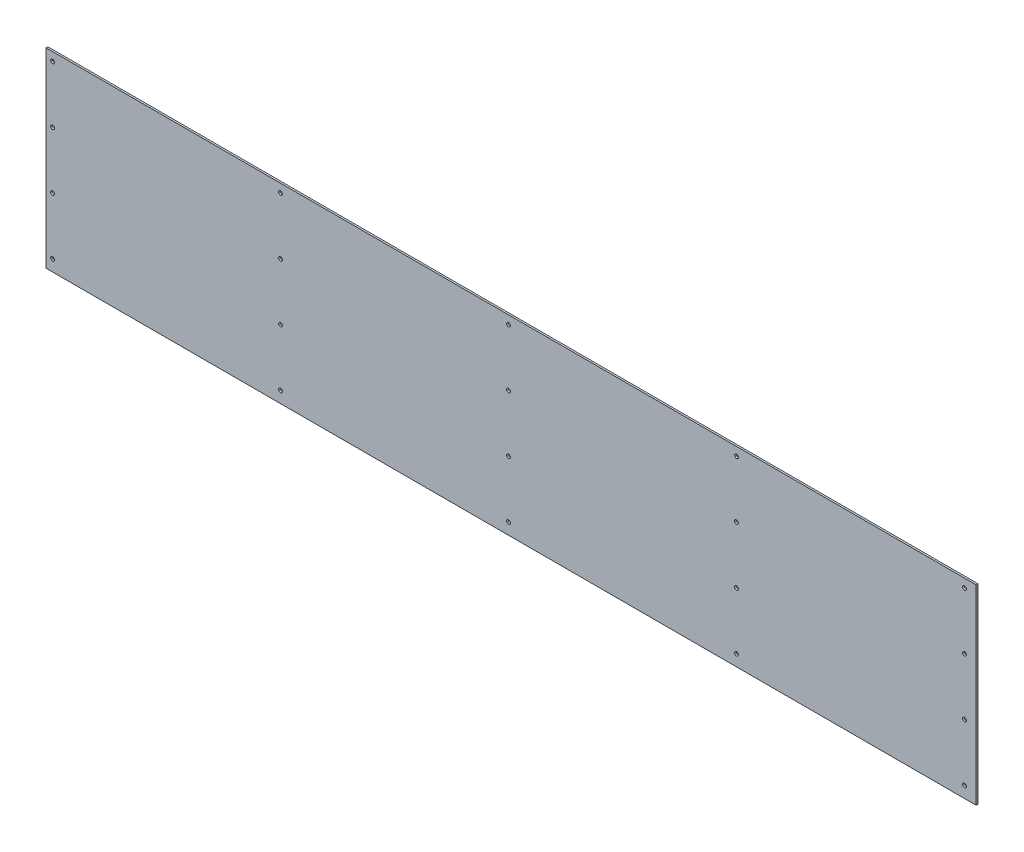
ISO-10303-21;
HEADER;
FILE_DESCRIPTION(('STEP AP214'),'2;1');
FILE_NAME('part.step','',(''),(''),'','','');
FILE_SCHEMA(('AUTOMOTIVE_DESIGN { 1 0 10303 214 1 1 1 1 }'));
ENDSEC;
DATA;
#1=APPLICATION_CONTEXT('core data for automotive mechanical design processes');
#2=APPLICATION_PROTOCOL_DEFINITION('international standard','automotive_design',2000,#1);
#3=PRODUCT_CONTEXT('',#1,'mechanical');
#4=PRODUCT('Part','Part','',(#3));
#5=PRODUCT_RELATED_PRODUCT_CATEGORY('part','',(#4));
#6=PRODUCT_DEFINITION_FORMATION('','',#4);
#7=PRODUCT_DEFINITION_CONTEXT('part definition',#1,'design');
#8=PRODUCT_DEFINITION('design','',#6,#7);
#9=PRODUCT_DEFINITION_SHAPE('','',#8);
#10=(LENGTH_UNIT() NAMED_UNIT(*) SI_UNIT(.MILLI.,.METRE.));
#11=(NAMED_UNIT(*) PLANE_ANGLE_UNIT() SI_UNIT($,.RADIAN.));
#12=(NAMED_UNIT(*) SI_UNIT($,.STERADIAN.) SOLID_ANGLE_UNIT());
#13=UNCERTAINTY_MEASURE_WITH_UNIT(LENGTH_MEASURE(1.E-05),#10,'distance_accuracy_value','');
#14=(GEOMETRIC_REPRESENTATION_CONTEXT(3) GLOBAL_UNCERTAINTY_ASSIGNED_CONTEXT((#13)) GLOBAL_UNIT_ASSIGNED_CONTEXT((#10,
#11,#12)) REPRESENTATION_CONTEXT('',''));
#15=CARTESIAN_POINT('',(0.,0.,0.));
#16=DIRECTION('',(0.,0.,1.));
#17=DIRECTION('',(1.,0.,0.));
#18=AXIS2_PLACEMENT_3D('',#15,#16,#17);
#19=CARTESIAN_POINT('',(-326.805932165718,168.065878378378,-3.175));
#20=DIRECTION('',(-1.,0.,0.));
#21=DIRECTION('',(0.,0.,1.));
#22=AXIS2_PLACEMENT_3D('',#19,#20,#21);
#23=PLANE('',#22);
#24=DIRECTION('',(0.,-1.,0.));
#25=VECTOR('',#24,1.);
#26=CARTESIAN_POINT('',(-326.805932165718,168.065878378378,0.));
#27=LINE('',#26,#25);
#28=CARTESIAN_POINT('',(-326.805932165718,168.065878378378,0.));
#29=VERTEX_POINT('',#28);
#30=CARTESIAN_POINT('',(-326.805932165718,-166.934121621622,0.));
#31=VERTEX_POINT('',#30);
#32=EDGE_CURVE('E103',#29,#31,#27,.T.);
#33=ORIENTED_EDGE('',*,*,#32,.F.);
#34=DIRECTION('',(0.,0.,1.));
#35=VECTOR('',#34,1.);
#36=CARTESIAN_POINT('',(-326.805932165718,168.065878378378,-3.175));
#37=LINE('',#36,#35);
#38=CARTESIAN_POINT('',(-326.805932165718,168.065878378378,-3.175));
#39=VERTEX_POINT('',#38);
#40=EDGE_CURVE('E11',#39,#29,#37,.T.);
#41=ORIENTED_EDGE('',*,*,#40,.F.);
#42=DIRECTION('',(0.,-1.,0.));
#43=VECTOR('',#42,1.);
#44=CARTESIAN_POINT('',(-326.805932165718,168.065878378378,-3.175));
#45=LINE('',#44,#43);
#46=CARTESIAN_POINT('',(-326.805932165718,-166.934121621622,-3.175));
#47=VERTEX_POINT('',#46);
#48=EDGE_CURVE('E96',#39,#47,#45,.T.);
#49=ORIENTED_EDGE('',*,*,#48,.T.);
#50=DIRECTION('',(0.,0.,1.));
#51=VECTOR('',#50,1.);
#52=CARTESIAN_POINT('',(-326.805932165718,-166.934121621622,-3.175));
#53=LINE('',#52,#51);
#54=EDGE_CURVE('E41',#47,#31,#53,.T.);
#55=ORIENTED_EDGE('',*,*,#54,.T.);
#56=EDGE_LOOP('',(#33,#41,#49,#55));
#57=FACE_BOUND('',#56,.T.);
#58=ADVANCED_FACE('F38',(#57),#23,.T.);
#59=CARTESIAN_POINT('',(-326.805932165718,168.065878378378,-3.175));
#60=DIRECTION('',(0.,1.,0.));
#61=DIRECTION('',(0.,0.,1.));
#62=AXIS2_PLACEMENT_3D('',#59,#60,#61);
#63=PLANE('',#62);
#64=DIRECTION('',(-1.,0.,0.));
#65=VECTOR('',#64,1.);
#66=CARTESIAN_POINT('',(-326.805932165718,168.065878378378,0.));
#67=LINE('',#66,#65);
#68=CARTESIAN_POINT('',(1305.19406783428,168.065878378378,0.));
#69=VERTEX_POINT('',#68);
#70=EDGE_CURVE('E98',#69,#29,#67,.T.);
#71=ORIENTED_EDGE('',*,*,#70,.F.);
#72=DIRECTION('',(0.,0.,1.));
#73=VECTOR('',#72,1.);
#74=CARTESIAN_POINT('',(1305.19406783428,168.065878378378,-3.175));
#75=LINE('',#74,#73);
#76=CARTESIAN_POINT('',(1305.19406783428,168.065878378378,-3.175));
#77=VERTEX_POINT('',#76);
#78=EDGE_CURVE('E47',#77,#69,#75,.T.);
#79=ORIENTED_EDGE('',*,*,#78,.F.);
#80=DIRECTION('',(-1.,0.,0.));
#81=VECTOR('',#80,1.);
#82=CARTESIAN_POINT('',(-326.805932165718,168.065878378378,-3.175));
#83=LINE('',#82,#81);
#84=EDGE_CURVE('E93',#77,#39,#83,.T.);
#85=ORIENTED_EDGE('',*,*,#84,.T.);
#86=ORIENTED_EDGE('',*,*,#40,.T.);
#87=EDGE_LOOP('',(#71,#79,#85,#86));
#88=FACE_BOUND('',#87,.T.);
#89=ADVANCED_FACE('F114',(#88),#63,.T.);
#90=CARTESIAN_POINT('',(1305.19406783428,168.065878378378,-3.175));
#91=DIRECTION('',(1.,0.,0.));
#92=DIRECTION('',(0.,0.,-1.));
#93=AXIS2_PLACEMENT_3D('',#90,#91,#92);
#94=PLANE('',#93);
#95=DIRECTION('',(0.,1.,0.));
#96=VECTOR('',#95,1.);
#97=CARTESIAN_POINT('',(1305.19406783428,168.065878378378,0.));
#98=LINE('',#97,#96);
#99=CARTESIAN_POINT('',(1305.19406783428,-166.934121621622,0.));
#100=VERTEX_POINT('',#99);
#101=EDGE_CURVE('E88',#100,#69,#98,.T.);
#102=ORIENTED_EDGE('',*,*,#101,.F.);
#103=DIRECTION('',(0.,0.,1.));
#104=VECTOR('',#103,1.);
#105=CARTESIAN_POINT('',(1305.19406783428,-166.934121621622,-3.175));
#106=LINE('',#105,#104);
#107=CARTESIAN_POINT('',(1305.19406783428,-166.934121621622,-3.175));
#108=VERTEX_POINT('',#107);
#109=EDGE_CURVE('E83',#108,#100,#106,.T.);
#110=ORIENTED_EDGE('',*,*,#109,.F.);
#111=DIRECTION('',(0.,1.,0.));
#112=VECTOR('',#111,1.);
#113=CARTESIAN_POINT('',(1305.19406783428,168.065878378378,-3.175));
#114=LINE('',#113,#112);
#115=EDGE_CURVE('E86',#108,#77,#114,.T.);
#116=ORIENTED_EDGE('',*,*,#115,.T.);
#117=ORIENTED_EDGE('',*,*,#78,.T.);
#118=EDGE_LOOP('',(#102,#110,#116,#117));
#119=FACE_BOUND('',#118,.T.);
#120=ADVANCED_FACE('F85',(#119),#94,.T.);
#121=CARTESIAN_POINT('',(-326.805932165718,-166.934121621622,-3.175));
#122=DIRECTION('',(0.,-1.,0.));
#123=DIRECTION('',(0.,0.,-1.));
#124=AXIS2_PLACEMENT_3D('',#121,#122,#123);
#125=PLANE('',#124);
#126=DIRECTION('',(1.,0.,0.));
#127=VECTOR('',#126,1.);
#128=CARTESIAN_POINT('',(-326.805932165718,-166.934121621622,0.));
#129=LINE('',#128,#127);
#130=EDGE_CURVE('E106',#31,#100,#129,.T.);
#131=ORIENTED_EDGE('',*,*,#130,.F.);
#132=ORIENTED_EDGE('',*,*,#54,.F.);
#133=DIRECTION('',(1.,0.,0.));
#134=VECTOR('',#133,1.);
#135=CARTESIAN_POINT('',(-326.805932165718,-166.934121621622,-3.175));
#136=LINE('',#135,#134);
#137=EDGE_CURVE('E92',#47,#108,#136,.T.);
#138=ORIENTED_EDGE('',*,*,#137,.T.);
#139=ORIENTED_EDGE('',*,*,#109,.T.);
#140=EDGE_LOOP('',(#131,#132,#138,#139));
#141=FACE_BOUND('',#140,.T.);
#142=ADVANCED_FACE('F95',(#141),#125,.T.);
#143=CARTESIAN_POINT('',(0.,0.,-3.175));
#144=DIRECTION('',(0.,0.,1.));
#145=DIRECTION('',(1.,0.,0.));
#146=AXIS2_PLACEMENT_3D('',#143,#144,#145);
#147=PLANE('',#146);
#148=CARTESIAN_POINT('',(1284.69406783428,153.065878378378,-3.175));
#149=DIRECTION('',(0.,0.,1.));
#150=DIRECTION('',(1.,0.,0.));
#151=AXIS2_PLACEMENT_3D('',#148,#149,#150);
#152=CIRCLE('',#151,3.3782);
#153=CARTESIAN_POINT('',(1288.07226783428,153.065878378378,-3.175));
#154=VERTEX_POINT('',#153);
#155=EDGE_CURVE('E219',#154,#154,#152,.T.);
#156=ORIENTED_EDGE('',*,*,#155,.T.);
#157=EDGE_LOOP('',(#156));
#158=FACE_BOUND('',#157,.T.);
#159=CARTESIAN_POINT('',(884.694067834282,153.065878378376,-3.175));
#160=DIRECTION('',(0.,0.,1.));
#161=DIRECTION('',(1.,0.,0.));
#162=AXIS2_PLACEMENT_3D('',#159,#160,#161);
#163=CIRCLE('',#162,3.3782);
#164=CARTESIAN_POINT('',(888.072267834282,153.065878378376,-3.175));
#165=VERTEX_POINT('',#164);
#166=EDGE_CURVE('E229',#165,#165,#163,.T.);
#167=ORIENTED_EDGE('',*,*,#166,.T.);
#168=EDGE_LOOP('',(#167));
#169=FACE_BOUND('',#168,.T.);
#170=CARTESIAN_POINT('',(484.694067834282,153.065878378373,-3.175));
#171=DIRECTION('',(0.,0.,1.));
#172=DIRECTION('',(1.,0.,0.));
#173=AXIS2_PLACEMENT_3D('',#170,#171,#172);
#174=CIRCLE('',#173,3.3782);
#175=CARTESIAN_POINT('',(488.072267834282,153.065878378373,-3.175));
#176=VERTEX_POINT('',#175);
#177=EDGE_CURVE('E235',#176,#176,#174,.T.);
#178=ORIENTED_EDGE('',*,*,#177,.T.);
#179=EDGE_LOOP('',(#178));
#180=FACE_BOUND('',#179,.T.);
#181=CARTESIAN_POINT('',(84.6940678342816,153.06587837837,-3.175));
#182=DIRECTION('',(0.,0.,1.));
#183=DIRECTION('',(1.,0.,0.));
#184=AXIS2_PLACEMENT_3D('',#181,#182,#183);
#185=CIRCLE('',#184,3.3782);
#186=CARTESIAN_POINT('',(88.0722678342816,153.06587837837,-3.175));
#187=VERTEX_POINT('',#186);
#188=EDGE_CURVE('E241',#187,#187,#185,.T.);
#189=ORIENTED_EDGE('',*,*,#188,.T.);
#190=EDGE_LOOP('',(#189));
#191=FACE_BOUND('',#190,.T.);
#192=CARTESIAN_POINT('',(-315.305932165718,153.065878378367,-3.175));
#193=DIRECTION('',(0.,0.,1.));
#194=DIRECTION('',(1.,0.,0.));
#195=AXIS2_PLACEMENT_3D('',#192,#193,#194);
#196=CIRCLE('',#195,3.3782);
#197=CARTESIAN_POINT('',(-311.927732165718,153.065878378367,-3.175));
#198=VERTEX_POINT('',#197);
#199=EDGE_CURVE('E247',#198,#198,#196,.T.);
#200=ORIENTED_EDGE('',*,*,#199,.T.);
#201=EDGE_LOOP('',(#200));
#202=FACE_BOUND('',#201,.T.);
#203=CARTESIAN_POINT('',(884.694067834283,53.0658783783756,-3.175));
#204=DIRECTION('',(0.,0.,1.));
#205=DIRECTION('',(1.,0.,0.));
#206=AXIS2_PLACEMENT_3D('',#203,#204,#205);
#207=CIRCLE('',#206,3.3782);
#208=CARTESIAN_POINT('',(888.072267834283,53.0658783783756,-3.175));
#209=VERTEX_POINT('',#208);
#210=EDGE_CURVE('E253',#209,#209,#207,.T.);
#211=ORIENTED_EDGE('',*,*,#210,.T.);
#212=EDGE_LOOP('',(#211));
#213=FACE_BOUND('',#212,.T.);
#214=CARTESIAN_POINT('',(484.694067834283,53.0658783783728,-3.175));
#215=DIRECTION('',(0.,0.,1.));
#216=DIRECTION('',(1.,0.,0.));
#217=AXIS2_PLACEMENT_3D('',#214,#215,#216);
#218=CIRCLE('',#217,3.3782);
#219=CARTESIAN_POINT('',(488.072267834283,53.0658783783728,-3.175));
#220=VERTEX_POINT('',#219);
#221=EDGE_CURVE('E259',#220,#220,#218,.T.);
#222=ORIENTED_EDGE('',*,*,#221,.T.);
#223=EDGE_LOOP('',(#222));
#224=FACE_BOUND('',#223,.T.);
#225=CARTESIAN_POINT('',(84.6940678342827,53.06587837837,-3.175));
#226=DIRECTION('',(0.,0.,1.));
#227=DIRECTION('',(1.,0.,0.));
#228=AXIS2_PLACEMENT_3D('',#225,#226,#227);
#229=CIRCLE('',#228,3.3782);
#230=CARTESIAN_POINT('',(88.0722678342827,53.06587837837,-3.175));
#231=VERTEX_POINT('',#230);
#232=EDGE_CURVE('E265',#231,#231,#229,.T.);
#233=ORIENTED_EDGE('',*,*,#232,.T.);
#234=EDGE_LOOP('',(#233));
#235=FACE_BOUND('',#234,.T.);
#236=CARTESIAN_POINT('',(-315.305932165717,53.0658783783673,-3.175));
#237=DIRECTION('',(0.,0.,1.));
#238=DIRECTION('',(1.,0.,0.));
#239=AXIS2_PLACEMENT_3D('',#236,#237,#238);
#240=CIRCLE('',#239,3.3782);
#241=CARTESIAN_POINT('',(-311.927732165717,53.0658783783673,-3.175));
#242=VERTEX_POINT('',#241);
#243=EDGE_CURVE('E271',#242,#242,#240,.T.);
#244=ORIENTED_EDGE('',*,*,#243,.T.);
#245=EDGE_LOOP('',(#244));
#246=FACE_BOUND('',#245,.T.);
#247=CARTESIAN_POINT('',(884.694067834284,-46.9341216216244,-3.175));
#248=DIRECTION('',(0.,0.,1.));
#249=DIRECTION('',(1.,0.,0.));
#250=AXIS2_PLACEMENT_3D('',#247,#248,#249);
#251=CIRCLE('',#250,3.3782);
#252=CARTESIAN_POINT('',(888.072267834284,-46.9341216216244,-3.175));
#253=VERTEX_POINT('',#252);
#254=EDGE_CURVE('E277',#253,#253,#251,.T.);
#255=ORIENTED_EDGE('',*,*,#254,.T.);
#256=EDGE_LOOP('',(#255));
#257=FACE_BOUND('',#256,.T.);
#258=CARTESIAN_POINT('',(484.694067834284,-46.9341216216272,-3.175));
#259=DIRECTION('',(0.,0.,1.));
#260=DIRECTION('',(1.,0.,0.));
#261=AXIS2_PLACEMENT_3D('',#258,#259,#260);
#262=CIRCLE('',#261,3.3782);
#263=CARTESIAN_POINT('',(488.072267834284,-46.9341216216272,-3.175));
#264=VERTEX_POINT('',#263);
#265=EDGE_CURVE('E283',#264,#264,#262,.T.);
#266=ORIENTED_EDGE('',*,*,#265,.T.);
#267=EDGE_LOOP('',(#266));
#268=FACE_BOUND('',#267,.T.);
#269=CARTESIAN_POINT('',(84.6940678342836,-46.93412162163,-3.175));
#270=DIRECTION('',(0.,0.,1.));
#271=DIRECTION('',(1.,0.,0.));
#272=AXIS2_PLACEMENT_3D('',#269,#270,#271);
#273=CIRCLE('',#272,3.3782);
#274=CARTESIAN_POINT('',(88.0722678342836,-46.93412162163,-3.175));
#275=VERTEX_POINT('',#274);
#276=EDGE_CURVE('E289',#275,#275,#273,.T.);
#277=ORIENTED_EDGE('',*,*,#276,.T.);
#278=EDGE_LOOP('',(#277));
#279=FACE_BOUND('',#278,.T.);
#280=CARTESIAN_POINT('',(-315.305932165716,-46.9341216216328,-3.175));
#281=DIRECTION('',(0.,0.,1.));
#282=DIRECTION('',(1.,0.,0.));
#283=AXIS2_PLACEMENT_3D('',#280,#281,#282);
#284=CIRCLE('',#283,3.3782);
#285=CARTESIAN_POINT('',(-311.927732165716,-46.9341216216328,-3.175));
#286=VERTEX_POINT('',#285);
#287=EDGE_CURVE('E295',#286,#286,#284,.T.);
#288=ORIENTED_EDGE('',*,*,#287,.T.);
#289=EDGE_LOOP('',(#288));
#290=FACE_BOUND('',#289,.T.);
#291=CARTESIAN_POINT('',(884.694067834285,-146.934121621624,-3.175));
#292=DIRECTION('',(0.,0.,1.));
#293=DIRECTION('',(1.,0.,0.));
#294=AXIS2_PLACEMENT_3D('',#291,#292,#293);
#295=CIRCLE('',#294,3.3782);
#296=CARTESIAN_POINT('',(888.072267834285,-146.934121621624,-3.175));
#297=VERTEX_POINT('',#296);
#298=EDGE_CURVE('E301',#297,#297,#295,.T.);
#299=ORIENTED_EDGE('',*,*,#298,.T.);
#300=EDGE_LOOP('',(#299));
#301=FACE_BOUND('',#300,.T.);
#302=CARTESIAN_POINT('',(484.694067834285,-146.934121621627,-3.175));
#303=DIRECTION('',(0.,0.,1.));
#304=DIRECTION('',(1.,0.,0.));
#305=AXIS2_PLACEMENT_3D('',#302,#303,#304);
#306=CIRCLE('',#305,3.3782);
#307=CARTESIAN_POINT('',(488.072267834285,-146.934121621627,-3.175));
#308=VERTEX_POINT('',#307);
#309=EDGE_CURVE('E307',#308,#308,#306,.T.);
#310=ORIENTED_EDGE('',*,*,#309,.T.);
#311=EDGE_LOOP('',(#310));
#312=FACE_BOUND('',#311,.T.);
#313=CARTESIAN_POINT('',(84.6940678342847,-146.93412162163,-3.175));
#314=DIRECTION('',(0.,0.,1.));
#315=DIRECTION('',(1.,0.,0.));
#316=AXIS2_PLACEMENT_3D('',#313,#314,#315);
#317=CIRCLE('',#316,3.3782);
#318=CARTESIAN_POINT('',(88.0722678342847,-146.93412162163,-3.175));
#319=VERTEX_POINT('',#318);
#320=EDGE_CURVE('E313',#319,#319,#317,.T.);
#321=ORIENTED_EDGE('',*,*,#320,.T.);
#322=EDGE_LOOP('',(#321));
#323=FACE_BOUND('',#322,.T.);
#324=CARTESIAN_POINT('',(-315.305932165715,-146.934121621633,-3.175));
#325=DIRECTION('',(0.,0.,1.));
#326=DIRECTION('',(1.,0.,0.));
#327=AXIS2_PLACEMENT_3D('',#324,#325,#326);
#328=CIRCLE('',#327,3.3782);
#329=CARTESIAN_POINT('',(-311.927732165715,-146.934121621633,-3.175));
#330=VERTEX_POINT('',#329);
#331=EDGE_CURVE('E319',#330,#330,#328,.T.);
#332=ORIENTED_EDGE('',*,*,#331,.T.);
#333=EDGE_LOOP('',(#332));
#334=FACE_BOUND('',#333,.T.);
#335=CARTESIAN_POINT('',(1284.69406783428,53.0658783783784,-3.175));
#336=DIRECTION('',(0.,0.,1.));
#337=DIRECTION('',(1.,0.,0.));
#338=AXIS2_PLACEMENT_3D('',#335,#336,#337);
#339=CIRCLE('',#338,3.3782);
#340=CARTESIAN_POINT('',(1288.07226783428,53.0658783783784,-3.175));
#341=VERTEX_POINT('',#340);
#342=EDGE_CURVE('E325',#341,#341,#339,.T.);
#343=ORIENTED_EDGE('',*,*,#342,.T.);
#344=EDGE_LOOP('',(#343));
#345=FACE_BOUND('',#344,.T.);
#346=CARTESIAN_POINT('',(1284.69406783428,-46.9341216216216,-3.175));
#347=DIRECTION('',(0.,0.,1.));
#348=DIRECTION('',(1.,0.,0.));
#349=AXIS2_PLACEMENT_3D('',#346,#347,#348);
#350=CIRCLE('',#349,3.3782);
#351=CARTESIAN_POINT('',(1288.07226783428,-46.9341216216216,-3.175));
#352=VERTEX_POINT('',#351);
#353=EDGE_CURVE('E331',#352,#352,#350,.T.);
#354=ORIENTED_EDGE('',*,*,#353,.T.);
#355=EDGE_LOOP('',(#354));
#356=FACE_BOUND('',#355,.T.);
#357=CARTESIAN_POINT('',(1284.69406783428,-146.934121621622,-3.175));
#358=DIRECTION('',(0.,0.,1.));
#359=DIRECTION('',(1.,0.,0.));
#360=AXIS2_PLACEMENT_3D('',#357,#358,#359);
#361=CIRCLE('',#360,3.3782);
#362=CARTESIAN_POINT('',(1288.07226783428,-146.934121621622,-3.175));
#363=VERTEX_POINT('',#362);
#364=EDGE_CURVE('E107',#363,#363,#361,.T.);
#365=ORIENTED_EDGE('',*,*,#364,.T.);
#366=EDGE_LOOP('',(#365));
#367=FACE_BOUND('',#366,.T.);
#368=ORIENTED_EDGE('',*,*,#48,.F.);
#369=ORIENTED_EDGE('',*,*,#84,.F.);
#370=ORIENTED_EDGE('',*,*,#115,.F.);
#371=ORIENTED_EDGE('',*,*,#137,.F.);
#372=EDGE_LOOP('',(#368,#369,#370,#371));
#373=FACE_BOUND('',#372,.T.);
#374=ADVANCED_FACE('F91',(#158,#169,#180,#191,#202,#213,#224,#235,#246,#257,#268,#279,#290,#301,
#312,#323,#334,#345,#356,#367,#373),#147,.F.);
#375=CARTESIAN_POINT('',(0.,0.,0.));
#376=DIRECTION('',(0.,0.,1.));
#377=DIRECTION('',(1.,0.,0.));
#378=AXIS2_PLACEMENT_3D('',#375,#376,#377);
#379=PLANE('',#378);
#380=CARTESIAN_POINT('',(1284.69406783428,153.065878378378,0.));
#381=DIRECTION('',(0.,0.,1.));
#382=DIRECTION('',(1.,0.,0.));
#383=AXIS2_PLACEMENT_3D('',#380,#381,#382);
#384=CIRCLE('',#383,3.3782);
#385=CARTESIAN_POINT('',(1288.07226783428,153.065878378378,0.));
#386=VERTEX_POINT('',#385);
#387=EDGE_CURVE('E222',#386,#386,#384,.T.);
#388=ORIENTED_EDGE('',*,*,#387,.F.);
#389=EDGE_LOOP('',(#388));
#390=FACE_BOUND('',#389,.T.);
#391=CARTESIAN_POINT('',(884.694067834282,153.065878378376,0.));
#392=DIRECTION('',(0.,0.,1.));
#393=DIRECTION('',(1.,0.,0.));
#394=AXIS2_PLACEMENT_3D('',#391,#392,#393);
#395=CIRCLE('',#394,3.3782);
#396=CARTESIAN_POINT('',(888.072267834282,153.065878378376,0.));
#397=VERTEX_POINT('',#396);
#398=EDGE_CURVE('E224',#397,#397,#395,.T.);
#399=ORIENTED_EDGE('',*,*,#398,.F.);
#400=EDGE_LOOP('',(#399));
#401=FACE_BOUND('',#400,.T.);
#402=CARTESIAN_POINT('',(484.694067834282,153.065878378373,0.));
#403=DIRECTION('',(0.,0.,1.));
#404=DIRECTION('',(1.,0.,0.));
#405=AXIS2_PLACEMENT_3D('',#402,#403,#404);
#406=CIRCLE('',#405,3.3782);
#407=CARTESIAN_POINT('',(488.072267834282,153.065878378373,0.));
#408=VERTEX_POINT('',#407);
#409=EDGE_CURVE('E232',#408,#408,#406,.T.);
#410=ORIENTED_EDGE('',*,*,#409,.F.);
#411=EDGE_LOOP('',(#410));
#412=FACE_BOUND('',#411,.T.);
#413=CARTESIAN_POINT('',(84.6940678342816,153.06587837837,0.));
#414=DIRECTION('',(0.,0.,1.));
#415=DIRECTION('',(1.,0.,0.));
#416=AXIS2_PLACEMENT_3D('',#413,#414,#415);
#417=CIRCLE('',#416,3.3782);
#418=CARTESIAN_POINT('',(88.0722678342816,153.06587837837,0.));
#419=VERTEX_POINT('',#418);
#420=EDGE_CURVE('E238',#419,#419,#417,.T.);
#421=ORIENTED_EDGE('',*,*,#420,.F.);
#422=EDGE_LOOP('',(#421));
#423=FACE_BOUND('',#422,.T.);
#424=CARTESIAN_POINT('',(-315.305932165718,153.065878378367,0.));
#425=DIRECTION('',(0.,0.,1.));
#426=DIRECTION('',(1.,0.,0.));
#427=AXIS2_PLACEMENT_3D('',#424,#425,#426);
#428=CIRCLE('',#427,3.3782);
#429=CARTESIAN_POINT('',(-311.927732165718,153.065878378367,0.));
#430=VERTEX_POINT('',#429);
#431=EDGE_CURVE('E244',#430,#430,#428,.T.);
#432=ORIENTED_EDGE('',*,*,#431,.F.);
#433=EDGE_LOOP('',(#432));
#434=FACE_BOUND('',#433,.T.);
#435=CARTESIAN_POINT('',(884.694067834283,53.0658783783756,0.));
#436=DIRECTION('',(0.,0.,1.));
#437=DIRECTION('',(1.,0.,0.));
#438=AXIS2_PLACEMENT_3D('',#435,#436,#437);
#439=CIRCLE('',#438,3.3782);
#440=CARTESIAN_POINT('',(888.072267834283,53.0658783783756,0.));
#441=VERTEX_POINT('',#440);
#442=EDGE_CURVE('E250',#441,#441,#439,.T.);
#443=ORIENTED_EDGE('',*,*,#442,.F.);
#444=EDGE_LOOP('',(#443));
#445=FACE_BOUND('',#444,.T.);
#446=CARTESIAN_POINT('',(484.694067834283,53.0658783783728,0.));
#447=DIRECTION('',(0.,0.,1.));
#448=DIRECTION('',(1.,0.,0.));
#449=AXIS2_PLACEMENT_3D('',#446,#447,#448);
#450=CIRCLE('',#449,3.3782);
#451=CARTESIAN_POINT('',(488.072267834283,53.0658783783728,0.));
#452=VERTEX_POINT('',#451);
#453=EDGE_CURVE('E256',#452,#452,#450,.T.);
#454=ORIENTED_EDGE('',*,*,#453,.F.);
#455=EDGE_LOOP('',(#454));
#456=FACE_BOUND('',#455,.T.);
#457=CARTESIAN_POINT('',(84.6940678342827,53.06587837837,0.));
#458=DIRECTION('',(0.,0.,1.));
#459=DIRECTION('',(1.,0.,0.));
#460=AXIS2_PLACEMENT_3D('',#457,#458,#459);
#461=CIRCLE('',#460,3.3782);
#462=CARTESIAN_POINT('',(88.0722678342827,53.06587837837,0.));
#463=VERTEX_POINT('',#462);
#464=EDGE_CURVE('E262',#463,#463,#461,.T.);
#465=ORIENTED_EDGE('',*,*,#464,.F.);
#466=EDGE_LOOP('',(#465));
#467=FACE_BOUND('',#466,.T.);
#468=CARTESIAN_POINT('',(-315.305932165717,53.0658783783673,0.));
#469=DIRECTION('',(0.,0.,1.));
#470=DIRECTION('',(1.,0.,0.));
#471=AXIS2_PLACEMENT_3D('',#468,#469,#470);
#472=CIRCLE('',#471,3.3782);
#473=CARTESIAN_POINT('',(-311.927732165717,53.0658783783673,0.));
#474=VERTEX_POINT('',#473);
#475=EDGE_CURVE('E268',#474,#474,#472,.T.);
#476=ORIENTED_EDGE('',*,*,#475,.F.);
#477=EDGE_LOOP('',(#476));
#478=FACE_BOUND('',#477,.T.);
#479=CARTESIAN_POINT('',(884.694067834284,-46.9341216216244,0.));
#480=DIRECTION('',(0.,0.,1.));
#481=DIRECTION('',(1.,0.,0.));
#482=AXIS2_PLACEMENT_3D('',#479,#480,#481);
#483=CIRCLE('',#482,3.3782);
#484=CARTESIAN_POINT('',(888.072267834284,-46.9341216216244,0.));
#485=VERTEX_POINT('',#484);
#486=EDGE_CURVE('E274',#485,#485,#483,.T.);
#487=ORIENTED_EDGE('',*,*,#486,.F.);
#488=EDGE_LOOP('',(#487));
#489=FACE_BOUND('',#488,.T.);
#490=CARTESIAN_POINT('',(484.694067834284,-46.9341216216272,0.));
#491=DIRECTION('',(0.,0.,1.));
#492=DIRECTION('',(1.,0.,0.));
#493=AXIS2_PLACEMENT_3D('',#490,#491,#492);
#494=CIRCLE('',#493,3.3782);
#495=CARTESIAN_POINT('',(488.072267834284,-46.9341216216272,0.));
#496=VERTEX_POINT('',#495);
#497=EDGE_CURVE('E280',#496,#496,#494,.T.);
#498=ORIENTED_EDGE('',*,*,#497,.F.);
#499=EDGE_LOOP('',(#498));
#500=FACE_BOUND('',#499,.T.);
#501=CARTESIAN_POINT('',(84.6940678342836,-46.93412162163,0.));
#502=DIRECTION('',(0.,0.,1.));
#503=DIRECTION('',(1.,0.,0.));
#504=AXIS2_PLACEMENT_3D('',#501,#502,#503);
#505=CIRCLE('',#504,3.3782);
#506=CARTESIAN_POINT('',(88.0722678342836,-46.93412162163,0.));
#507=VERTEX_POINT('',#506);
#508=EDGE_CURVE('E286',#507,#507,#505,.T.);
#509=ORIENTED_EDGE('',*,*,#508,.F.);
#510=EDGE_LOOP('',(#509));
#511=FACE_BOUND('',#510,.T.);
#512=CARTESIAN_POINT('',(-315.305932165716,-46.9341216216328,0.));
#513=DIRECTION('',(0.,0.,1.));
#514=DIRECTION('',(1.,0.,0.));
#515=AXIS2_PLACEMENT_3D('',#512,#513,#514);
#516=CIRCLE('',#515,3.3782);
#517=CARTESIAN_POINT('',(-311.927732165716,-46.9341216216328,0.));
#518=VERTEX_POINT('',#517);
#519=EDGE_CURVE('E292',#518,#518,#516,.T.);
#520=ORIENTED_EDGE('',*,*,#519,.F.);
#521=EDGE_LOOP('',(#520));
#522=FACE_BOUND('',#521,.T.);
#523=CARTESIAN_POINT('',(884.694067834285,-146.934121621624,0.));
#524=DIRECTION('',(0.,0.,1.));
#525=DIRECTION('',(1.,0.,0.));
#526=AXIS2_PLACEMENT_3D('',#523,#524,#525);
#527=CIRCLE('',#526,3.3782);
#528=CARTESIAN_POINT('',(888.072267834285,-146.934121621624,0.));
#529=VERTEX_POINT('',#528);
#530=EDGE_CURVE('E298',#529,#529,#527,.T.);
#531=ORIENTED_EDGE('',*,*,#530,.F.);
#532=EDGE_LOOP('',(#531));
#533=FACE_BOUND('',#532,.T.);
#534=CARTESIAN_POINT('',(484.694067834285,-146.934121621627,0.));
#535=DIRECTION('',(0.,0.,1.));
#536=DIRECTION('',(1.,0.,0.));
#537=AXIS2_PLACEMENT_3D('',#534,#535,#536);
#538=CIRCLE('',#537,3.3782);
#539=CARTESIAN_POINT('',(488.072267834285,-146.934121621627,0.));
#540=VERTEX_POINT('',#539);
#541=EDGE_CURVE('E304',#540,#540,#538,.T.);
#542=ORIENTED_EDGE('',*,*,#541,.F.);
#543=EDGE_LOOP('',(#542));
#544=FACE_BOUND('',#543,.T.);
#545=CARTESIAN_POINT('',(84.6940678342847,-146.93412162163,0.));
#546=DIRECTION('',(0.,0.,1.));
#547=DIRECTION('',(1.,0.,0.));
#548=AXIS2_PLACEMENT_3D('',#545,#546,#547);
#549=CIRCLE('',#548,3.3782);
#550=CARTESIAN_POINT('',(88.0722678342847,-146.93412162163,0.));
#551=VERTEX_POINT('',#550);
#552=EDGE_CURVE('E310',#551,#551,#549,.T.);
#553=ORIENTED_EDGE('',*,*,#552,.F.);
#554=EDGE_LOOP('',(#553));
#555=FACE_BOUND('',#554,.T.);
#556=CARTESIAN_POINT('',(-315.305932165715,-146.934121621633,0.));
#557=DIRECTION('',(0.,0.,1.));
#558=DIRECTION('',(1.,0.,0.));
#559=AXIS2_PLACEMENT_3D('',#556,#557,#558);
#560=CIRCLE('',#559,3.3782);
#561=CARTESIAN_POINT('',(-311.927732165715,-146.934121621633,0.));
#562=VERTEX_POINT('',#561);
#563=EDGE_CURVE('E316',#562,#562,#560,.T.);
#564=ORIENTED_EDGE('',*,*,#563,.F.);
#565=EDGE_LOOP('',(#564));
#566=FACE_BOUND('',#565,.T.);
#567=CARTESIAN_POINT('',(1284.69406783428,53.0658783783784,0.));
#568=DIRECTION('',(0.,0.,1.));
#569=DIRECTION('',(1.,0.,0.));
#570=AXIS2_PLACEMENT_3D('',#567,#568,#569);
#571=CIRCLE('',#570,3.3782);
#572=CARTESIAN_POINT('',(1288.07226783428,53.0658783783784,0.));
#573=VERTEX_POINT('',#572);
#574=EDGE_CURVE('E322',#573,#573,#571,.T.);
#575=ORIENTED_EDGE('',*,*,#574,.F.);
#576=EDGE_LOOP('',(#575));
#577=FACE_BOUND('',#576,.T.);
#578=CARTESIAN_POINT('',(1284.69406783428,-46.9341216216216,0.));
#579=DIRECTION('',(0.,0.,1.));
#580=DIRECTION('',(1.,0.,0.));
#581=AXIS2_PLACEMENT_3D('',#578,#579,#580);
#582=CIRCLE('',#581,3.3782);
#583=CARTESIAN_POINT('',(1288.07226783428,-46.9341216216216,0.));
#584=VERTEX_POINT('',#583);
#585=EDGE_CURVE('E328',#584,#584,#582,.T.);
#586=ORIENTED_EDGE('',*,*,#585,.F.);
#587=EDGE_LOOP('',(#586));
#588=FACE_BOUND('',#587,.T.);
#589=CARTESIAN_POINT('',(1284.69406783428,-146.934121621622,0.));
#590=DIRECTION('',(0.,0.,1.));
#591=DIRECTION('',(1.,0.,0.));
#592=AXIS2_PLACEMENT_3D('',#589,#590,#591);
#593=CIRCLE('',#592,3.3782);
#594=CARTESIAN_POINT('',(1288.07226783428,-146.934121621622,0.));
#595=VERTEX_POINT('',#594);
#596=EDGE_CURVE('E334',#595,#595,#593,.T.);
#597=ORIENTED_EDGE('',*,*,#596,.F.);
#598=EDGE_LOOP('',(#597));
#599=FACE_BOUND('',#598,.T.);
#600=ORIENTED_EDGE('',*,*,#32,.T.);
#601=ORIENTED_EDGE('',*,*,#130,.T.);
#602=ORIENTED_EDGE('',*,*,#101,.T.);
#603=ORIENTED_EDGE('',*,*,#70,.T.);
#604=EDGE_LOOP('',(#600,#601,#602,#603));
#605=FACE_BOUND('',#604,.T.);
#606=ADVANCED_FACE('F113',(#390,#401,#412,#423,#434,#445,#456,#467,#478,#489,#500,#511,#522,
#533,#544,#555,#566,#577,#588,#599,#605),#379,.T.);
#607=CARTESIAN_POINT('',(1284.69406783428,-146.934121621622,0.));
#608=DIRECTION('',(0.,0.,1.));
#609=DIRECTION('',(1.,0.,0.));
#610=AXIS2_PLACEMENT_3D('',#607,#608,#609);
#611=CYLINDRICAL_SURFACE('',#610,3.3782);
#612=ORIENTED_EDGE('',*,*,#364,.F.);
#613=EDGE_LOOP('',(#612));
#614=FACE_BOUND('',#613,.T.);
#615=ORIENTED_EDGE('',*,*,#596,.T.);
#616=EDGE_LOOP('',(#615));
#617=FACE_BOUND('',#616,.T.);
#618=ADVANCED_FACE('F132',(#614,#617),#611,.F.);
#619=CARTESIAN_POINT('',(1284.69406783428,-46.9341216216216,0.));
#620=DIRECTION('',(0.,0.,1.));
#621=DIRECTION('',(1.,0.,0.));
#622=AXIS2_PLACEMENT_3D('',#619,#620,#621);
#623=CYLINDRICAL_SURFACE('',#622,3.3782);
#624=ORIENTED_EDGE('',*,*,#353,.F.);
#625=EDGE_LOOP('',(#624));
#626=FACE_BOUND('',#625,.T.);
#627=ORIENTED_EDGE('',*,*,#585,.T.);
#628=EDGE_LOOP('',(#627));
#629=FACE_BOUND('',#628,.T.);
#630=ADVANCED_FACE('F139',(#626,#629),#623,.F.);
#631=CARTESIAN_POINT('',(1284.69406783428,53.0658783783784,0.));
#632=DIRECTION('',(0.,0.,1.));
#633=DIRECTION('',(1.,0.,0.));
#634=AXIS2_PLACEMENT_3D('',#631,#632,#633);
#635=CYLINDRICAL_SURFACE('',#634,3.3782);
#636=ORIENTED_EDGE('',*,*,#342,.F.);
#637=EDGE_LOOP('',(#636));
#638=FACE_BOUND('',#637,.T.);
#639=ORIENTED_EDGE('',*,*,#574,.T.);
#640=EDGE_LOOP('',(#639));
#641=FACE_BOUND('',#640,.T.);
#642=ADVANCED_FACE('F143',(#638,#641),#635,.F.);
#643=CARTESIAN_POINT('',(-315.305932165715,-146.934121621633,0.));
#644=DIRECTION('',(0.,0.,1.));
#645=DIRECTION('',(1.,0.,0.));
#646=AXIS2_PLACEMENT_3D('',#643,#644,#645);
#647=CYLINDRICAL_SURFACE('',#646,3.3782);
#648=ORIENTED_EDGE('',*,*,#331,.F.);
#649=EDGE_LOOP('',(#648));
#650=FACE_BOUND('',#649,.T.);
#651=ORIENTED_EDGE('',*,*,#563,.T.);
#652=EDGE_LOOP('',(#651));
#653=FACE_BOUND('',#652,.T.);
#654=ADVANCED_FACE('F147',(#650,#653),#647,.F.);
#655=CARTESIAN_POINT('',(84.6940678342847,-146.93412162163,0.));
#656=DIRECTION('',(0.,0.,1.));
#657=DIRECTION('',(1.,0.,0.));
#658=AXIS2_PLACEMENT_3D('',#655,#656,#657);
#659=CYLINDRICAL_SURFACE('',#658,3.3782);
#660=ORIENTED_EDGE('',*,*,#320,.F.);
#661=EDGE_LOOP('',(#660));
#662=FACE_BOUND('',#661,.T.);
#663=ORIENTED_EDGE('',*,*,#552,.T.);
#664=EDGE_LOOP('',(#663));
#665=FACE_BOUND('',#664,.T.);
#666=ADVANCED_FACE('F151',(#662,#665),#659,.F.);
#667=CARTESIAN_POINT('',(484.694067834285,-146.934121621627,0.));
#668=DIRECTION('',(0.,0.,1.));
#669=DIRECTION('',(1.,0.,0.));
#670=AXIS2_PLACEMENT_3D('',#667,#668,#669);
#671=CYLINDRICAL_SURFACE('',#670,3.3782);
#672=ORIENTED_EDGE('',*,*,#309,.F.);
#673=EDGE_LOOP('',(#672));
#674=FACE_BOUND('',#673,.T.);
#675=ORIENTED_EDGE('',*,*,#541,.T.);
#676=EDGE_LOOP('',(#675));
#677=FACE_BOUND('',#676,.T.);
#678=ADVANCED_FACE('F155',(#674,#677),#671,.F.);
#679=CARTESIAN_POINT('',(884.694067834285,-146.934121621624,0.));
#680=DIRECTION('',(0.,0.,1.));
#681=DIRECTION('',(1.,0.,0.));
#682=AXIS2_PLACEMENT_3D('',#679,#680,#681);
#683=CYLINDRICAL_SURFACE('',#682,3.3782);
#684=ORIENTED_EDGE('',*,*,#298,.F.);
#685=EDGE_LOOP('',(#684));
#686=FACE_BOUND('',#685,.T.);
#687=ORIENTED_EDGE('',*,*,#530,.T.);
#688=EDGE_LOOP('',(#687));
#689=FACE_BOUND('',#688,.T.);
#690=ADVANCED_FACE('F159',(#686,#689),#683,.F.);
#691=CARTESIAN_POINT('',(-315.305932165716,-46.9341216216328,0.));
#692=DIRECTION('',(0.,0.,1.));
#693=DIRECTION('',(1.,0.,0.));
#694=AXIS2_PLACEMENT_3D('',#691,#692,#693);
#695=CYLINDRICAL_SURFACE('',#694,3.3782);
#696=ORIENTED_EDGE('',*,*,#287,.F.);
#697=EDGE_LOOP('',(#696));
#698=FACE_BOUND('',#697,.T.);
#699=ORIENTED_EDGE('',*,*,#519,.T.);
#700=EDGE_LOOP('',(#699));
#701=FACE_BOUND('',#700,.T.);
#702=ADVANCED_FACE('F163',(#698,#701),#695,.F.);
#703=CARTESIAN_POINT('',(84.6940678342836,-46.93412162163,0.));
#704=DIRECTION('',(0.,0.,1.));
#705=DIRECTION('',(1.,0.,0.));
#706=AXIS2_PLACEMENT_3D('',#703,#704,#705);
#707=CYLINDRICAL_SURFACE('',#706,3.3782);
#708=ORIENTED_EDGE('',*,*,#276,.F.);
#709=EDGE_LOOP('',(#708));
#710=FACE_BOUND('',#709,.T.);
#711=ORIENTED_EDGE('',*,*,#508,.T.);
#712=EDGE_LOOP('',(#711));
#713=FACE_BOUND('',#712,.T.);
#714=ADVANCED_FACE('F167',(#710,#713),#707,.F.);
#715=CARTESIAN_POINT('',(484.694067834284,-46.9341216216272,0.));
#716=DIRECTION('',(0.,0.,1.));
#717=DIRECTION('',(1.,0.,0.));
#718=AXIS2_PLACEMENT_3D('',#715,#716,#717);
#719=CYLINDRICAL_SURFACE('',#718,3.3782);
#720=ORIENTED_EDGE('',*,*,#265,.F.);
#721=EDGE_LOOP('',(#720));
#722=FACE_BOUND('',#721,.T.);
#723=ORIENTED_EDGE('',*,*,#497,.T.);
#724=EDGE_LOOP('',(#723));
#725=FACE_BOUND('',#724,.T.);
#726=ADVANCED_FACE('F171',(#722,#725),#719,.F.);
#727=CARTESIAN_POINT('',(884.694067834284,-46.9341216216244,0.));
#728=DIRECTION('',(0.,0.,1.));
#729=DIRECTION('',(1.,0.,0.));
#730=AXIS2_PLACEMENT_3D('',#727,#728,#729);
#731=CYLINDRICAL_SURFACE('',#730,3.3782);
#732=ORIENTED_EDGE('',*,*,#254,.F.);
#733=EDGE_LOOP('',(#732));
#734=FACE_BOUND('',#733,.T.);
#735=ORIENTED_EDGE('',*,*,#486,.T.);
#736=EDGE_LOOP('',(#735));
#737=FACE_BOUND('',#736,.T.);
#738=ADVANCED_FACE('F175',(#734,#737),#731,.F.);
#739=CARTESIAN_POINT('',(-315.305932165717,53.0658783783673,0.));
#740=DIRECTION('',(0.,0.,1.));
#741=DIRECTION('',(1.,0.,0.));
#742=AXIS2_PLACEMENT_3D('',#739,#740,#741);
#743=CYLINDRICAL_SURFACE('',#742,3.3782);
#744=ORIENTED_EDGE('',*,*,#243,.F.);
#745=EDGE_LOOP('',(#744));
#746=FACE_BOUND('',#745,.T.);
#747=ORIENTED_EDGE('',*,*,#475,.T.);
#748=EDGE_LOOP('',(#747));
#749=FACE_BOUND('',#748,.T.);
#750=ADVANCED_FACE('F179',(#746,#749),#743,.F.);
#751=CARTESIAN_POINT('',(84.6940678342827,53.06587837837,0.));
#752=DIRECTION('',(0.,0.,1.));
#753=DIRECTION('',(1.,0.,0.));
#754=AXIS2_PLACEMENT_3D('',#751,#752,#753);
#755=CYLINDRICAL_SURFACE('',#754,3.3782);
#756=ORIENTED_EDGE('',*,*,#232,.F.);
#757=EDGE_LOOP('',(#756));
#758=FACE_BOUND('',#757,.T.);
#759=ORIENTED_EDGE('',*,*,#464,.T.);
#760=EDGE_LOOP('',(#759));
#761=FACE_BOUND('',#760,.T.);
#762=ADVANCED_FACE('F183',(#758,#761),#755,.F.);
#763=CARTESIAN_POINT('',(484.694067834283,53.0658783783728,0.));
#764=DIRECTION('',(0.,0.,1.));
#765=DIRECTION('',(1.,0.,0.));
#766=AXIS2_PLACEMENT_3D('',#763,#764,#765);
#767=CYLINDRICAL_SURFACE('',#766,3.3782);
#768=ORIENTED_EDGE('',*,*,#221,.F.);
#769=EDGE_LOOP('',(#768));
#770=FACE_BOUND('',#769,.T.);
#771=ORIENTED_EDGE('',*,*,#453,.T.);
#772=EDGE_LOOP('',(#771));
#773=FACE_BOUND('',#772,.T.);
#774=ADVANCED_FACE('F187',(#770,#773),#767,.F.);
#775=CARTESIAN_POINT('',(884.694067834283,53.0658783783756,0.));
#776=DIRECTION('',(0.,0.,1.));
#777=DIRECTION('',(1.,0.,0.));
#778=AXIS2_PLACEMENT_3D('',#775,#776,#777);
#779=CYLINDRICAL_SURFACE('',#778,3.3782);
#780=ORIENTED_EDGE('',*,*,#210,.F.);
#781=EDGE_LOOP('',(#780));
#782=FACE_BOUND('',#781,.T.);
#783=ORIENTED_EDGE('',*,*,#442,.T.);
#784=EDGE_LOOP('',(#783));
#785=FACE_BOUND('',#784,.T.);
#786=ADVANCED_FACE('F191',(#782,#785),#779,.F.);
#787=CARTESIAN_POINT('',(-315.305932165718,153.065878378367,0.));
#788=DIRECTION('',(0.,0.,1.));
#789=DIRECTION('',(1.,0.,0.));
#790=AXIS2_PLACEMENT_3D('',#787,#788,#789);
#791=CYLINDRICAL_SURFACE('',#790,3.3782);
#792=ORIENTED_EDGE('',*,*,#199,.F.);
#793=EDGE_LOOP('',(#792));
#794=FACE_BOUND('',#793,.T.);
#795=ORIENTED_EDGE('',*,*,#431,.T.);
#796=EDGE_LOOP('',(#795));
#797=FACE_BOUND('',#796,.T.);
#798=ADVANCED_FACE('F195',(#794,#797),#791,.F.);
#799=CARTESIAN_POINT('',(84.6940678342816,153.06587837837,0.));
#800=DIRECTION('',(0.,0.,1.));
#801=DIRECTION('',(1.,0.,0.));
#802=AXIS2_PLACEMENT_3D('',#799,#800,#801);
#803=CYLINDRICAL_SURFACE('',#802,3.3782);
#804=ORIENTED_EDGE('',*,*,#188,.F.);
#805=EDGE_LOOP('',(#804));
#806=FACE_BOUND('',#805,.T.);
#807=ORIENTED_EDGE('',*,*,#420,.T.);
#808=EDGE_LOOP('',(#807));
#809=FACE_BOUND('',#808,.T.);
#810=ADVANCED_FACE('F199',(#806,#809),#803,.F.);
#811=CARTESIAN_POINT('',(484.694067834282,153.065878378373,0.));
#812=DIRECTION('',(0.,0.,1.));
#813=DIRECTION('',(1.,0.,0.));
#814=AXIS2_PLACEMENT_3D('',#811,#812,#813);
#815=CYLINDRICAL_SURFACE('',#814,3.3782);
#816=ORIENTED_EDGE('',*,*,#177,.F.);
#817=EDGE_LOOP('',(#816));
#818=FACE_BOUND('',#817,.T.);
#819=ORIENTED_EDGE('',*,*,#409,.T.);
#820=EDGE_LOOP('',(#819));
#821=FACE_BOUND('',#820,.T.);
#822=ADVANCED_FACE('F203',(#818,#821),#815,.F.);
#823=CARTESIAN_POINT('',(884.694067834282,153.065878378376,0.));
#824=DIRECTION('',(0.,0.,1.));
#825=DIRECTION('',(1.,0.,0.));
#826=AXIS2_PLACEMENT_3D('',#823,#824,#825);
#827=CYLINDRICAL_SURFACE('',#826,3.3782);
#828=ORIENTED_EDGE('',*,*,#166,.F.);
#829=EDGE_LOOP('',(#828));
#830=FACE_BOUND('',#829,.T.);
#831=ORIENTED_EDGE('',*,*,#398,.T.);
#832=EDGE_LOOP('',(#831));
#833=FACE_BOUND('',#832,.T.);
#834=ADVANCED_FACE('F207',(#830,#833),#827,.F.);
#835=CARTESIAN_POINT('',(1284.69406783428,153.065878378378,0.));
#836=DIRECTION('',(0.,0.,1.));
#837=DIRECTION('',(1.,0.,0.));
#838=AXIS2_PLACEMENT_3D('',#835,#836,#837);
#839=CYLINDRICAL_SURFACE('',#838,3.3782);
#840=ORIENTED_EDGE('',*,*,#155,.F.);
#841=EDGE_LOOP('',(#840));
#842=FACE_BOUND('',#841,.T.);
#843=ORIENTED_EDGE('',*,*,#387,.T.);
#844=EDGE_LOOP('',(#843));
#845=FACE_BOUND('',#844,.T.);
#846=ADVANCED_FACE('F211',(#842,#845),#839,.F.);
#847=CLOSED_SHELL('',(#58,#89,#120,#142,#374,#606,#618,#630,#642,#654,#666,#678,#690,#702,#714,
#726,#738,#750,#762,#774,#786,#798,#810,#822,#834,#846));
#848=MANIFOLD_SOLID_BREP('B2',#847);
#849=ADVANCED_BREP_SHAPE_REPRESENTATION('',(#18,#848),#14);
#850=SHAPE_DEFINITION_REPRESENTATION(#9,#849);
ENDSEC;
END-ISO-10303-21;
